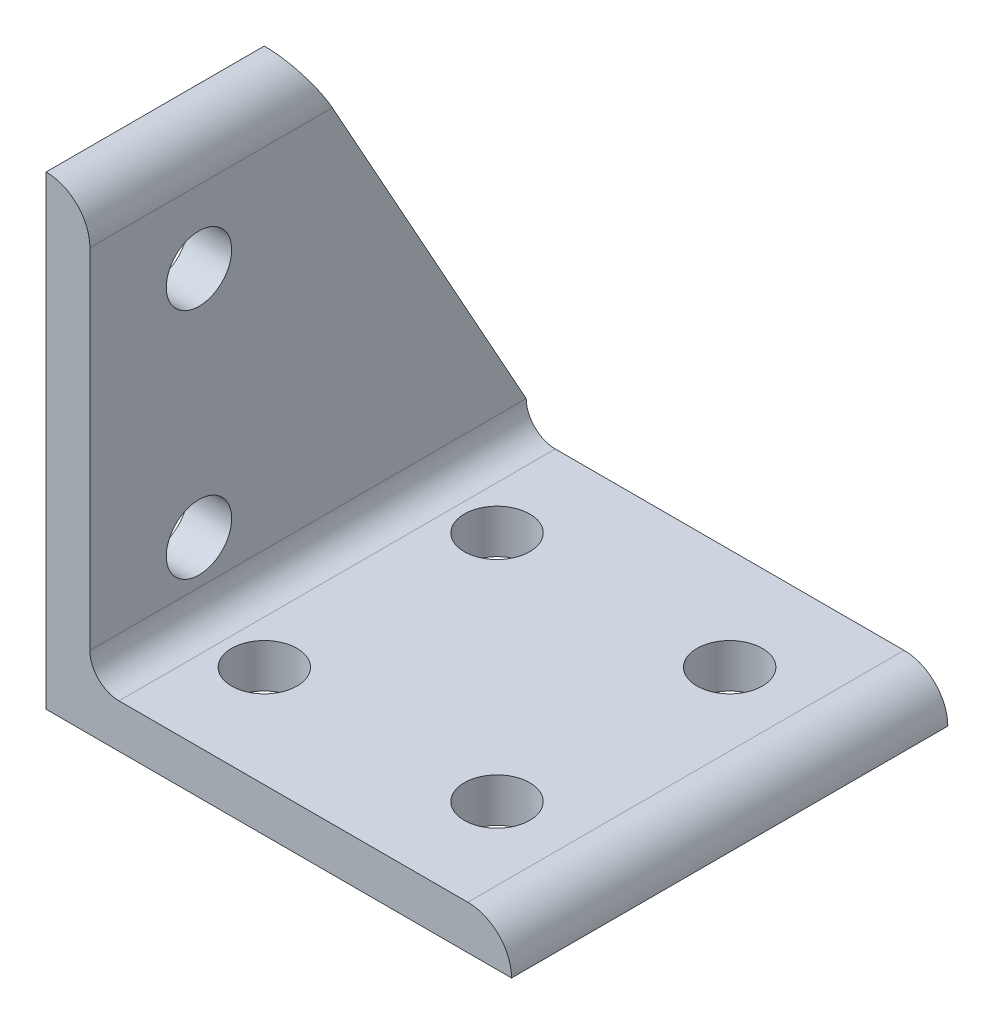
ISO-10303-21;
HEADER;
FILE_DESCRIPTION(('STEP AP214'),'2;1');
FILE_NAME('part.step','',(''),(''),'','','');
FILE_SCHEMA(('AUTOMOTIVE_DESIGN { 1 0 10303 214 1 1 1 1 }'));
ENDSEC;
DATA;
#1=APPLICATION_CONTEXT('core data for automotive mechanical design processes');
#2=APPLICATION_PROTOCOL_DEFINITION('international standard','automotive_design',2000,#1);
#3=PRODUCT_CONTEXT('',#1,'mechanical');
#4=PRODUCT('Part','Part','',(#3));
#5=PRODUCT_RELATED_PRODUCT_CATEGORY('part','',(#4));
#6=PRODUCT_DEFINITION_FORMATION('','',#4);
#7=PRODUCT_DEFINITION_CONTEXT('part definition',#1,'design');
#8=PRODUCT_DEFINITION('design','',#6,#7);
#9=PRODUCT_DEFINITION_SHAPE('','',#8);
#10=(LENGTH_UNIT() NAMED_UNIT(*) SI_UNIT(.MILLI.,.METRE.));
#11=(NAMED_UNIT(*) PLANE_ANGLE_UNIT() SI_UNIT($,.RADIAN.));
#12=(NAMED_UNIT(*) SI_UNIT($,.STERADIAN.) SOLID_ANGLE_UNIT());
#13=UNCERTAINTY_MEASURE_WITH_UNIT(LENGTH_MEASURE(1.E-05),#10,'distance_accuracy_value','');
#14=(GEOMETRIC_REPRESENTATION_CONTEXT(3) GLOBAL_UNCERTAINTY_ASSIGNED_CONTEXT((#13)) GLOBAL_UNIT_ASSIGNED_CONTEXT((#10,
#11,#12)) REPRESENTATION_CONTEXT('',''));
#15=CARTESIAN_POINT('',(0.,0.,0.));
#16=DIRECTION('',(0.,0.,1.));
#17=DIRECTION('',(1.,0.,0.));
#18=AXIS2_PLACEMENT_3D('',#15,#16,#17);
#19=CARTESIAN_POINT('',(-25.4,20.6248,-23.8125));
#20=DIRECTION('',(0.,0.,1.));
#21=DIRECTION('',(1.,0.,0.));
#22=AXIS2_PLACEMENT_3D('',#19,#20,#21);
#23=CYLINDRICAL_SURFACE('',#22,4.7752);
#24=CARTESIAN_POINT('',(-25.4,20.6248,-2.65367516301126));
#25=DIRECTION('',(0.,-0.485752909125678,0.874096168208019));
#26=DIRECTION('',(0.,0.874096168208019,0.485752909125678));
#27=AXIS2_PLACEMENT_3D('',#24,#25,#26);
#28=ELLIPSE('',#27,5.46301445273421,4.7752);
#29=CARTESIAN_POINT('',(-25.4,25.4,0.));
#30=VERTEX_POINT('',#29);
#31=CARTESIAN_POINT('',(-20.6248,20.6248,-2.65367516301126));
#32=VERTEX_POINT('',#31);
#33=EDGE_CURVE('E180',#30,#32,#28,.F.);
#34=ORIENTED_EDGE('',*,*,#33,.F.);
#35=DIRECTION('',(0.,0.,1.));
#36=VECTOR('',#35,1.);
#37=CARTESIAN_POINT('',(-25.4,25.4,-23.8125));
#38=LINE('',#37,#36);
#39=CARTESIAN_POINT('',(-25.4,25.4,23.8125));
#40=VERTEX_POINT('',#39);
#41=EDGE_CURVE('E50',#30,#40,#38,.T.);
#42=ORIENTED_EDGE('',*,*,#41,.T.);
#43=CARTESIAN_POINT('',(-25.4,20.6248,23.8125));
#44=DIRECTION('',(0.,0.,1.));
#45=DIRECTION('',(1.,0.,0.));
#46=AXIS2_PLACEMENT_3D('',#43,#44,#45);
#47=CIRCLE('',#46,4.7752);
#48=CARTESIAN_POINT('',(-20.6248,20.6248,23.8125));
#49=VERTEX_POINT('',#48);
#50=EDGE_CURVE('E179',#49,#40,#47,.T.);
#51=ORIENTED_EDGE('',*,*,#50,.F.);
#52=DIRECTION('',(0.,0.,1.));
#53=VECTOR('',#52,1.);
#54=CARTESIAN_POINT('',(-20.6248,20.6248,-23.8125));
#55=LINE('',#54,#53);
#56=EDGE_CURVE('E11',#32,#49,#55,.T.);
#57=ORIENTED_EDGE('',*,*,#56,.F.);
#58=EDGE_LOOP('',(#34,#42,#51,#57));
#59=FACE_BOUND('',#58,.T.);
#60=ADVANCED_FACE('F47',(#59),#23,.T.);
#61=CARTESIAN_POINT('',(-20.6248,20.6248,-23.8125));
#62=DIRECTION('',(1.,0.,0.));
#63=DIRECTION('',(0.,1.,0.));
#64=AXIS2_PLACEMENT_3D('',#61,#62,#63);
#65=PLANE('',#64);
#66=CARTESIAN_POINT('',(-20.6248,12.7,11.90625));
#67=DIRECTION('',(1.,0.,0.));
#68=DIRECTION('',(0.,1.,0.));
#69=AXIS2_PLACEMENT_3D('',#66,#67,#68);
#70=CIRCLE('',#69,3.5687);
#71=CARTESIAN_POINT('',(-20.6248,16.2687,11.90625));
#72=VERTEX_POINT('',#71);
#73=EDGE_CURVE('E224',#72,#72,#70,.T.);
#74=ORIENTED_EDGE('',*,*,#73,.F.);
#75=EDGE_LOOP('',(#74));
#76=FACE_BOUND('',#75,.T.);
#77=CARTESIAN_POINT('',(-20.6248,-12.7,11.90625));
#78=DIRECTION('',(1.,0.,0.));
#79=DIRECTION('',(0.,-1.,0.));
#80=AXIS2_PLACEMENT_3D('',#77,#78,#79);
#81=CIRCLE('',#80,3.5687);
#82=CARTESIAN_POINT('',(-20.6248,-16.2687,11.90625));
#83=VERTEX_POINT('',#82);
#84=EDGE_CURVE('E215',#83,#83,#81,.T.);
#85=ORIENTED_EDGE('',*,*,#84,.F.);
#86=EDGE_LOOP('',(#85));
#87=FACE_BOUND('',#86,.T.);
#88=DIRECTION('',(0.,-0.874096168208019,-0.485752909125678));
#89=VECTOR('',#88,1.);
#90=CARTESIAN_POINT('',(-20.6248,11.640873919187,-7.64622448177962));
#91=LINE('',#90,#89);
#92=CARTESIAN_POINT('',(-20.6248,-17.4498,-23.8125));
#93=VERTEX_POINT('',#92);
#94=EDGE_CURVE('E64',#32,#93,#91,.T.);
#95=ORIENTED_EDGE('',*,*,#94,.F.);
#96=ORIENTED_EDGE('',*,*,#56,.T.);
#97=DIRECTION('',(0.,1.,0.));
#98=VECTOR('',#97,1.);
#99=CARTESIAN_POINT('',(-20.6248,20.6248,23.8125));
#100=LINE('',#99,#98);
#101=CARTESIAN_POINT('',(-20.6248,-17.4498,23.8125));
#102=VERTEX_POINT('',#101);
#103=EDGE_CURVE('E136',#102,#49,#100,.T.);
#104=ORIENTED_EDGE('',*,*,#103,.F.);
#105=DIRECTION('',(0.,0.,1.));
#106=VECTOR('',#105,1.);
#107=CARTESIAN_POINT('',(-20.6248,-17.4498,-23.8125));
#108=LINE('',#107,#106);
#109=EDGE_CURVE('E56',#93,#102,#108,.T.);
#110=ORIENTED_EDGE('',*,*,#109,.F.);
#111=EDGE_LOOP('',(#95,#96,#104,#110));
#112=FACE_BOUND('',#111,.T.);
#113=ADVANCED_FACE('F212',(#76,#87,#112),#65,.T.);
#114=CARTESIAN_POINT('',(-17.4498,-17.4498,-23.8125));
#115=DIRECTION('',(0.,0.,1.));
#116=DIRECTION('',(1.,0.,0.));
#117=AXIS2_PLACEMENT_3D('',#114,#115,#116);
#118=CYLINDRICAL_SURFACE('',#117,3.175);
#119=ORIENTED_EDGE('',*,*,#109,.T.);
#120=CARTESIAN_POINT('',(-17.4498,-17.4498,23.8125));
#121=DIRECTION('',(0.,0.,-1.));
#122=DIRECTION('',(1.,0.,0.));
#123=AXIS2_PLACEMENT_3D('',#120,#121,#122);
#124=CIRCLE('',#123,3.175);
#125=CARTESIAN_POINT('',(-17.4498,-20.6248,23.8125));
#126=VERTEX_POINT('',#125);
#127=EDGE_CURVE('E145',#126,#102,#124,.T.);
#128=ORIENTED_EDGE('',*,*,#127,.F.);
#129=DIRECTION('',(0.,0.,1.));
#130=VECTOR('',#129,1.);
#131=CARTESIAN_POINT('',(-17.4498,-20.6248,-23.8125));
#132=LINE('',#131,#130);
#133=CARTESIAN_POINT('',(-17.4498,-20.6248,-23.8125));
#134=VERTEX_POINT('',#133);
#135=EDGE_CURVE('E72',#134,#126,#132,.T.);
#136=ORIENTED_EDGE('',*,*,#135,.F.);
#137=CARTESIAN_POINT('',(-17.4498,-17.4498,-23.8125));
#138=DIRECTION('',(0.,0.,-1.));
#139=DIRECTION('',(1.,0.,0.));
#140=AXIS2_PLACEMENT_3D('',#137,#138,#139);
#141=CIRCLE('',#140,3.175);
#142=EDGE_CURVE('E156',#134,#93,#141,.T.);
#143=ORIENTED_EDGE('',*,*,#142,.T.);
#144=EDGE_LOOP('',(#119,#128,#136,#143));
#145=FACE_BOUND('',#144,.T.);
#146=ADVANCED_FACE('F278',(#145),#118,.F.);
#147=CARTESIAN_POINT('',(-17.4498,-20.6248,-23.8125));
#148=DIRECTION('',(0.,1.,0.));
#149=DIRECTION('',(-1.,0.,0.));
#150=AXIS2_PLACEMENT_3D('',#147,#148,#149);
#151=PLANE('',#150);
#152=CARTESIAN_POINT('',(-12.7,-20.6248,12.7));
#153=DIRECTION('',(0.,1.,0.));
#154=DIRECTION('',(1.,0.,0.));
#155=AXIS2_PLACEMENT_3D('',#152,#153,#154);
#156=CIRCLE('',#155,3.5687);
#157=CARTESIAN_POINT('',(-9.1313,-20.6248,12.7));
#158=VERTEX_POINT('',#157);
#159=EDGE_CURVE('E238',#158,#158,#156,.T.);
#160=ORIENTED_EDGE('',*,*,#159,.F.);
#161=EDGE_LOOP('',(#160));
#162=FACE_BOUND('',#161,.T.);
#163=CARTESIAN_POINT('',(12.7,-20.6248,12.7));
#164=DIRECTION('',(0.,1.,0.));
#165=DIRECTION('',(1.,0.,0.));
#166=AXIS2_PLACEMENT_3D('',#163,#164,#165);
#167=CIRCLE('',#166,3.5687);
#168=CARTESIAN_POINT('',(16.2687,-20.6248,12.7));
#169=VERTEX_POINT('',#168);
#170=EDGE_CURVE('E246',#169,#169,#167,.T.);
#171=ORIENTED_EDGE('',*,*,#170,.F.);
#172=EDGE_LOOP('',(#171));
#173=FACE_BOUND('',#172,.T.);
#174=CARTESIAN_POINT('',(12.7,-20.6248,-12.7));
#175=DIRECTION('',(0.,1.,0.));
#176=DIRECTION('',(-1.,0.,0.));
#177=AXIS2_PLACEMENT_3D('',#174,#175,#176);
#178=CIRCLE('',#177,3.5687);
#179=CARTESIAN_POINT('',(9.1313,-20.6248,-12.7));
#180=VERTEX_POINT('',#179);
#181=EDGE_CURVE('E254',#180,#180,#178,.T.);
#182=ORIENTED_EDGE('',*,*,#181,.F.);
#183=EDGE_LOOP('',(#182));
#184=FACE_BOUND('',#183,.T.);
#185=CARTESIAN_POINT('',(-12.7,-20.6248,-12.7));
#186=DIRECTION('',(0.,1.,0.));
#187=DIRECTION('',(-1.,0.,0.));
#188=AXIS2_PLACEMENT_3D('',#185,#186,#187);
#189=CIRCLE('',#188,3.5687);
#190=CARTESIAN_POINT('',(-16.2687,-20.6248,-12.7));
#191=VERTEX_POINT('',#190);
#192=EDGE_CURVE('E230',#191,#191,#189,.T.);
#193=ORIENTED_EDGE('',*,*,#192,.F.);
#194=EDGE_LOOP('',(#193));
#195=FACE_BOUND('',#194,.T.);
#196=ORIENTED_EDGE('',*,*,#135,.T.);
#197=DIRECTION('',(-1.,0.,0.));
#198=VECTOR('',#197,1.);
#199=CARTESIAN_POINT('',(-17.4498,-20.6248,23.8125));
#200=LINE('',#199,#198);
#201=CARTESIAN_POINT('',(20.6248,-20.6248,23.8125));
#202=VERTEX_POINT('',#201);
#203=EDGE_CURVE('E205',#202,#126,#200,.T.);
#204=ORIENTED_EDGE('',*,*,#203,.F.);
#205=DIRECTION('',(0.,0.,1.));
#206=VECTOR('',#205,1.);
#207=CARTESIAN_POINT('',(20.6248,-20.6248,-23.8125));
#208=LINE('',#207,#206);
#209=CARTESIAN_POINT('',(20.6248,-20.6248,-23.8125));
#210=VERTEX_POINT('',#209);
#211=EDGE_CURVE('E163',#210,#202,#208,.T.);
#212=ORIENTED_EDGE('',*,*,#211,.F.);
#213=DIRECTION('',(-1.,0.,0.));
#214=VECTOR('',#213,1.);
#215=CARTESIAN_POINT('',(-17.4498,-20.6248,-23.8125));
#216=LINE('',#215,#214);
#217=EDGE_CURVE('E152',#210,#134,#216,.T.);
#218=ORIENTED_EDGE('',*,*,#217,.T.);
#219=EDGE_LOOP('',(#196,#204,#212,#218));
#220=FACE_BOUND('',#219,.T.);
#221=ADVANCED_FACE('F274',(#162,#173,#184,#195,#220),#151,.T.);
#222=CARTESIAN_POINT('',(20.6248,-25.4,-23.8125));
#223=DIRECTION('',(0.,0.,1.));
#224=DIRECTION('',(1.,0.,0.));
#225=AXIS2_PLACEMENT_3D('',#222,#223,#224);
#226=CYLINDRICAL_SURFACE('',#225,4.7752);
#227=ORIENTED_EDGE('',*,*,#211,.T.);
#228=CARTESIAN_POINT('',(20.6248,-25.4,23.8125));
#229=DIRECTION('',(0.,0.,1.));
#230=DIRECTION('',(-1.,0.,0.));
#231=AXIS2_PLACEMENT_3D('',#228,#229,#230);
#232=CIRCLE('',#231,4.7752);
#233=CARTESIAN_POINT('',(25.4,-25.4,23.8125));
#234=VERTEX_POINT('',#233);
#235=EDGE_CURVE('E201',#234,#202,#232,.T.);
#236=ORIENTED_EDGE('',*,*,#235,.F.);
#237=DIRECTION('',(0.,0.,1.));
#238=VECTOR('',#237,1.);
#239=CARTESIAN_POINT('',(25.4,-25.4,-23.8125));
#240=LINE('',#239,#238);
#241=CARTESIAN_POINT('',(25.4,-25.4,-23.8125));
#242=VERTEX_POINT('',#241);
#243=EDGE_CURVE('E166',#242,#234,#240,.T.);
#244=ORIENTED_EDGE('',*,*,#243,.F.);
#245=CARTESIAN_POINT('',(20.6248,-25.4,-23.8125));
#246=DIRECTION('',(0.,0.,1.));
#247=DIRECTION('',(-1.,0.,0.));
#248=AXIS2_PLACEMENT_3D('',#245,#246,#247);
#249=CIRCLE('',#248,4.7752);
#250=EDGE_CURVE('E141',#242,#210,#249,.T.);
#251=ORIENTED_EDGE('',*,*,#250,.T.);
#252=EDGE_LOOP('',(#227,#236,#244,#251));
#253=FACE_BOUND('',#252,.T.);
#254=ADVANCED_FACE('F277',(#253),#226,.T.);
#255=CARTESIAN_POINT('',(-25.4,-25.4,-23.8125));
#256=DIRECTION('',(0.,-1.,0.));
#257=DIRECTION('',(1.,0.,0.));
#258=AXIS2_PLACEMENT_3D('',#255,#256,#257);
#259=PLANE('',#258);
#260=CARTESIAN_POINT('',(-12.7,-25.4,12.7));
#261=DIRECTION('',(0.,1.,0.));
#262=DIRECTION('',(1.,0.,0.));
#263=AXIS2_PLACEMENT_3D('',#260,#261,#262);
#264=CIRCLE('',#263,3.5687);
#265=CARTESIAN_POINT('',(-9.1313,-25.4,12.7));
#266=VERTEX_POINT('',#265);
#267=EDGE_CURVE('E242',#266,#266,#264,.T.);
#268=ORIENTED_EDGE('',*,*,#267,.T.);
#269=EDGE_LOOP('',(#268));
#270=FACE_BOUND('',#269,.T.);
#271=CARTESIAN_POINT('',(12.7,-25.4,12.7));
#272=DIRECTION('',(0.,1.,0.));
#273=DIRECTION('',(1.,0.,0.));
#274=AXIS2_PLACEMENT_3D('',#271,#272,#273);
#275=CIRCLE('',#274,3.5687);
#276=CARTESIAN_POINT('',(16.2687,-25.4,12.7));
#277=VERTEX_POINT('',#276);
#278=EDGE_CURVE('E250',#277,#277,#275,.T.);
#279=ORIENTED_EDGE('',*,*,#278,.T.);
#280=EDGE_LOOP('',(#279));
#281=FACE_BOUND('',#280,.T.);
#282=CARTESIAN_POINT('',(12.7,-25.4,-12.7));
#283=DIRECTION('',(0.,1.,0.));
#284=DIRECTION('',(-1.,0.,0.));
#285=AXIS2_PLACEMENT_3D('',#282,#283,#284);
#286=CIRCLE('',#285,3.5687);
#287=CARTESIAN_POINT('',(9.1313,-25.4,-12.7));
#288=VERTEX_POINT('',#287);
#289=EDGE_CURVE('E234',#288,#288,#286,.T.);
#290=ORIENTED_EDGE('',*,*,#289,.T.);
#291=EDGE_LOOP('',(#290));
#292=FACE_BOUND('',#291,.T.);
#293=CARTESIAN_POINT('',(-12.7,-25.4,-12.7));
#294=DIRECTION('',(0.,1.,0.));
#295=DIRECTION('',(-1.,0.,0.));
#296=AXIS2_PLACEMENT_3D('',#293,#294,#295);
#297=CIRCLE('',#296,3.5687);
#298=CARTESIAN_POINT('',(-16.2687,-25.4,-12.7));
#299=VERTEX_POINT('',#298);
#300=EDGE_CURVE('E220',#299,#299,#297,.T.);
#301=ORIENTED_EDGE('',*,*,#300,.T.);
#302=EDGE_LOOP('',(#301));
#303=FACE_BOUND('',#302,.T.);
#304=ORIENTED_EDGE('',*,*,#243,.T.);
#305=DIRECTION('',(1.,0.,0.));
#306=VECTOR('',#305,1.);
#307=CARTESIAN_POINT('',(-25.4,-25.4,23.8125));
#308=LINE('',#307,#306);
#309=CARTESIAN_POINT('',(-25.4,-25.4,23.8125));
#310=VERTEX_POINT('',#309);
#311=EDGE_CURVE('E186',#310,#234,#308,.T.);
#312=ORIENTED_EDGE('',*,*,#311,.F.);
#313=DIRECTION('',(0.,0.,1.));
#314=VECTOR('',#313,1.);
#315=CARTESIAN_POINT('',(-25.4,-25.4,-23.8125));
#316=LINE('',#315,#314);
#317=CARTESIAN_POINT('',(-25.4,-25.4,-23.8125));
#318=VERTEX_POINT('',#317);
#319=EDGE_CURVE('E168',#318,#310,#316,.T.);
#320=ORIENTED_EDGE('',*,*,#319,.F.);
#321=DIRECTION('',(1.,0.,0.));
#322=VECTOR('',#321,1.);
#323=CARTESIAN_POINT('',(-25.4,-25.4,-23.8125));
#324=LINE('',#323,#322);
#325=EDGE_CURVE('E134',#318,#242,#324,.T.);
#326=ORIENTED_EDGE('',*,*,#325,.T.);
#327=EDGE_LOOP('',(#304,#312,#320,#326));
#328=FACE_BOUND('',#327,.T.);
#329=ADVANCED_FACE('F263',(#270,#281,#292,#303,#328),#259,.T.);
#330=CARTESIAN_POINT('',(-25.4,25.4,-23.8125));
#331=DIRECTION('',(-1.,0.,0.));
#332=DIRECTION('',(0.,-1.,0.));
#333=AXIS2_PLACEMENT_3D('',#330,#331,#332);
#334=PLANE('',#333);
#335=CARTESIAN_POINT('',(-25.4,12.7,11.90625));
#336=DIRECTION('',(1.,0.,0.));
#337=DIRECTION('',(0.,1.,0.));
#338=AXIS2_PLACEMENT_3D('',#335,#336,#337);
#339=CIRCLE('',#338,3.5687);
#340=CARTESIAN_POINT('',(-25.4,16.2687,11.90625));
#341=VERTEX_POINT('',#340);
#342=EDGE_CURVE('E128',#341,#341,#339,.T.);
#343=ORIENTED_EDGE('',*,*,#342,.T.);
#344=EDGE_LOOP('',(#343));
#345=FACE_BOUND('',#344,.T.);
#346=CARTESIAN_POINT('',(-25.4,-12.7,11.90625));
#347=DIRECTION('',(1.,0.,0.));
#348=DIRECTION('',(0.,-1.,0.));
#349=AXIS2_PLACEMENT_3D('',#346,#347,#348);
#350=CIRCLE('',#349,3.5687);
#351=CARTESIAN_POINT('',(-25.4,-16.2687,11.90625));
#352=VERTEX_POINT('',#351);
#353=EDGE_CURVE('E219',#352,#352,#350,.T.);
#354=ORIENTED_EDGE('',*,*,#353,.T.);
#355=EDGE_LOOP('',(#354));
#356=FACE_BOUND('',#355,.T.);
#357=DIRECTION('',(0.,-0.874096168208019,-0.485752909125677));
#358=VECTOR('',#357,1.);
#359=CARTESIAN_POINT('',(-25.4,-17.4498,-23.8125));
#360=LINE('',#359,#358);
#361=CARTESIAN_POINT('',(-25.4,-17.4498,-23.8125));
#362=VERTEX_POINT('',#361);
#363=EDGE_CURVE('E114',#30,#362,#360,.T.);
#364=ORIENTED_EDGE('',*,*,#363,.T.);
#365=DIRECTION('',(0.,-1.,0.));
#366=VECTOR('',#365,1.);
#367=CARTESIAN_POINT('',(-25.4,25.4,-23.8125));
#368=LINE('',#367,#366);
#369=EDGE_CURVE('E124',#362,#318,#368,.T.);
#370=ORIENTED_EDGE('',*,*,#369,.T.);
#371=ORIENTED_EDGE('',*,*,#319,.T.);
#372=DIRECTION('',(0.,-1.,0.));
#373=VECTOR('',#372,1.);
#374=CARTESIAN_POINT('',(-25.4,25.4,23.8125));
#375=LINE('',#374,#373);
#376=EDGE_CURVE('E181',#40,#310,#375,.T.);
#377=ORIENTED_EDGE('',*,*,#376,.F.);
#378=ORIENTED_EDGE('',*,*,#41,.F.);
#379=EDGE_LOOP('',(#364,#370,#371,#377,#378));
#380=FACE_BOUND('',#379,.T.);
#381=ADVANCED_FACE('F123',(#345,#356,#380),#334,.T.);
#382=CARTESIAN_POINT('',(-25.4,20.6248,-23.8125));
#383=DIRECTION('',(0.,0.,1.));
#384=DIRECTION('',(1.,0.,0.));
#385=AXIS2_PLACEMENT_3D('',#382,#383,#384);
#386=PLANE('',#385);
#387=ORIENTED_EDGE('',*,*,#369,.F.);
#388=DIRECTION('',(1.,0.,0.));
#389=VECTOR('',#388,1.);
#390=CARTESIAN_POINT('',(-25.4,-17.4498,-23.8125));
#391=LINE('',#390,#389);
#392=EDGE_CURVE('E111',#362,#93,#391,.T.);
#393=ORIENTED_EDGE('',*,*,#392,.T.);
#394=ORIENTED_EDGE('',*,*,#142,.F.);
#395=ORIENTED_EDGE('',*,*,#217,.F.);
#396=ORIENTED_EDGE('',*,*,#250,.F.);
#397=ORIENTED_EDGE('',*,*,#325,.F.);
#398=EDGE_LOOP('',(#387,#393,#394,#395,#396,#397));
#399=FACE_BOUND('',#398,.T.);
#400=ADVANCED_FACE('F131',(#399),#386,.F.);
#401=CARTESIAN_POINT('',(-25.4,20.6248,23.8125));
#402=DIRECTION('',(0.,0.,1.));
#403=DIRECTION('',(1.,0.,0.));
#404=AXIS2_PLACEMENT_3D('',#401,#402,#403);
#405=PLANE('',#404);
#406=ORIENTED_EDGE('',*,*,#50,.T.);
#407=ORIENTED_EDGE('',*,*,#376,.T.);
#408=ORIENTED_EDGE('',*,*,#311,.T.);
#409=ORIENTED_EDGE('',*,*,#235,.T.);
#410=ORIENTED_EDGE('',*,*,#203,.T.);
#411=ORIENTED_EDGE('',*,*,#127,.T.);
#412=ORIENTED_EDGE('',*,*,#103,.T.);
#413=EDGE_LOOP('',(#406,#407,#408,#409,#410,#411,#412));
#414=FACE_BOUND('',#413,.T.);
#415=ADVANCED_FACE('F188',(#414),#405,.T.);
#416=CARTESIAN_POINT('',(-25.4,-17.4498,-23.8125));
#417=DIRECTION('',(0.,-0.485752909125678,0.874096168208019));
#418=DIRECTION('',(0.,-0.874096168208019,-0.485752909125678));
#419=AXIS2_PLACEMENT_3D('',#416,#417,#418);
#420=PLANE('',#419);
#421=ORIENTED_EDGE('',*,*,#33,.T.);
#422=ORIENTED_EDGE('',*,*,#94,.T.);
#423=ORIENTED_EDGE('',*,*,#392,.F.);
#424=ORIENTED_EDGE('',*,*,#363,.F.);
#425=EDGE_LOOP('',(#421,#422,#423,#424));
#426=FACE_BOUND('',#425,.T.);
#427=ADVANCED_FACE('F113',(#426),#420,.F.);
#428=CARTESIAN_POINT('',(-25.4,-12.7,11.90625));
#429=DIRECTION('',(1.,0.,0.));
#430=DIRECTION('',(0.,1.,0.));
#431=AXIS2_PLACEMENT_3D('',#428,#429,#430);
#432=CYLINDRICAL_SURFACE('',#431,3.5687);
#433=ORIENTED_EDGE('',*,*,#353,.F.);
#434=EDGE_LOOP('',(#433));
#435=FACE_BOUND('',#434,.T.);
#436=ORIENTED_EDGE('',*,*,#84,.T.);
#437=EDGE_LOOP('',(#436));
#438=FACE_BOUND('',#437,.T.);
#439=ADVANCED_FACE('F314',(#435,#438),#432,.F.);
#440=CARTESIAN_POINT('',(-25.4,12.7,11.90625));
#441=DIRECTION('',(1.,0.,0.));
#442=DIRECTION('',(0.,1.,0.));
#443=AXIS2_PLACEMENT_3D('',#440,#441,#442);
#444=CYLINDRICAL_SURFACE('',#443,3.5687);
#445=ORIENTED_EDGE('',*,*,#342,.F.);
#446=EDGE_LOOP('',(#445));
#447=FACE_BOUND('',#446,.T.);
#448=ORIENTED_EDGE('',*,*,#73,.T.);
#449=EDGE_LOOP('',(#448));
#450=FACE_BOUND('',#449,.T.);
#451=ADVANCED_FACE('F317',(#447,#450),#444,.F.);
#452=CARTESIAN_POINT('',(-12.7,-25.4,-12.7));
#453=DIRECTION('',(0.,1.,0.));
#454=DIRECTION('',(-1.,0.,0.));
#455=AXIS2_PLACEMENT_3D('',#452,#453,#454);
#456=CYLINDRICAL_SURFACE('',#455,3.5687);
#457=ORIENTED_EDGE('',*,*,#300,.F.);
#458=EDGE_LOOP('',(#457));
#459=FACE_BOUND('',#458,.T.);
#460=ORIENTED_EDGE('',*,*,#192,.T.);
#461=EDGE_LOOP('',(#460));
#462=FACE_BOUND('',#461,.T.);
#463=ADVANCED_FACE('F270',(#459,#462),#456,.F.);
#464=CARTESIAN_POINT('',(12.7,-25.4,-12.7));
#465=DIRECTION('',(0.,1.,0.));
#466=DIRECTION('',(-1.,0.,0.));
#467=AXIS2_PLACEMENT_3D('',#464,#465,#466);
#468=CYLINDRICAL_SURFACE('',#467,3.5687);
#469=ORIENTED_EDGE('',*,*,#289,.F.);
#470=EDGE_LOOP('',(#469));
#471=FACE_BOUND('',#470,.T.);
#472=ORIENTED_EDGE('',*,*,#181,.T.);
#473=EDGE_LOOP('',(#472));
#474=FACE_BOUND('',#473,.T.);
#475=ADVANCED_FACE('F266',(#471,#474),#468,.F.);
#476=CARTESIAN_POINT('',(12.7,-25.4,12.7));
#477=DIRECTION('',(0.,1.,0.));
#478=DIRECTION('',(-1.,0.,0.));
#479=AXIS2_PLACEMENT_3D('',#476,#477,#478);
#480=CYLINDRICAL_SURFACE('',#479,3.5687);
#481=ORIENTED_EDGE('',*,*,#278,.F.);
#482=EDGE_LOOP('',(#481));
#483=FACE_BOUND('',#482,.T.);
#484=ORIENTED_EDGE('',*,*,#170,.T.);
#485=EDGE_LOOP('',(#484));
#486=FACE_BOUND('',#485,.T.);
#487=ADVANCED_FACE('F269',(#483,#486),#480,.F.);
#488=CARTESIAN_POINT('',(-12.7,-25.4,12.7));
#489=DIRECTION('',(0.,1.,0.));
#490=DIRECTION('',(-1.,0.,0.));
#491=AXIS2_PLACEMENT_3D('',#488,#489,#490);
#492=CYLINDRICAL_SURFACE('',#491,3.5687);
#493=ORIENTED_EDGE('',*,*,#267,.F.);
#494=EDGE_LOOP('',(#493));
#495=FACE_BOUND('',#494,.T.);
#496=ORIENTED_EDGE('',*,*,#159,.T.);
#497=EDGE_LOOP('',(#496));
#498=FACE_BOUND('',#497,.T.);
#499=ADVANCED_FACE('F325',(#495,#498),#492,.F.);
#500=CLOSED_SHELL('',(#60,#113,#146,#221,#254,#329,#381,#400,#415,#427,#439,#451,#463,#475,#487,#499));
#501=MANIFOLD_SOLID_BREP('B2',#500);
#502=ADVANCED_BREP_SHAPE_REPRESENTATION('',(#18,#501),#14);
#503=SHAPE_DEFINITION_REPRESENTATION(#9,#502);
ENDSEC;
END-ISO-10303-21;
